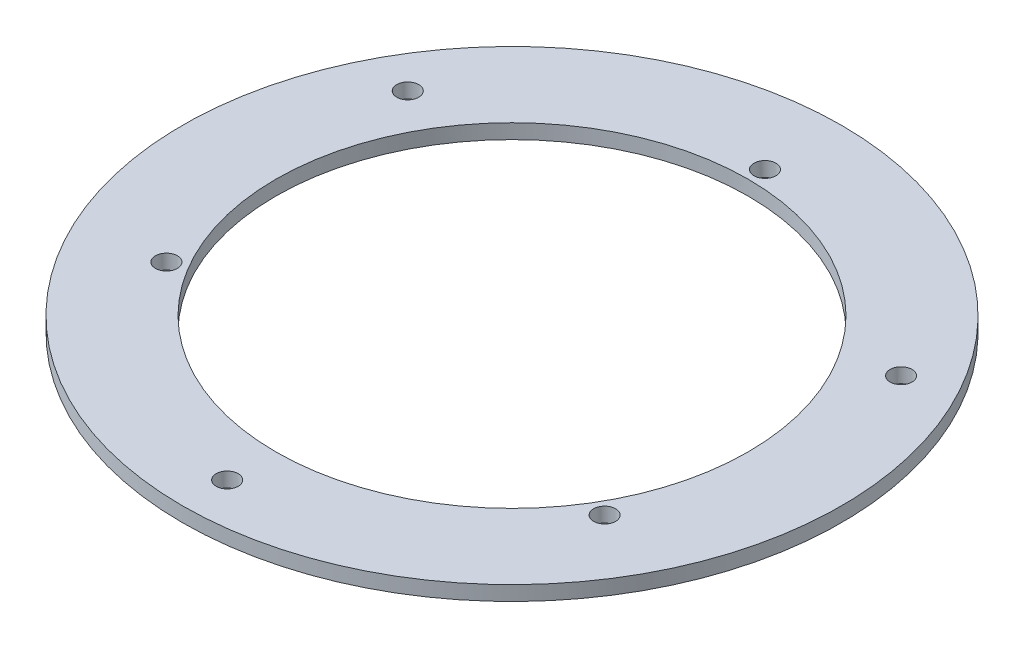
ISO-10303-21;
HEADER;
FILE_DESCRIPTION(('STEP AP214'),'2;1');
FILE_NAME('part.step','',(''),(''),'','','');
FILE_SCHEMA(('AUTOMOTIVE_DESIGN { 1 0 10303 214 1 1 1 1 }'));
ENDSEC;
DATA;
#1=APPLICATION_CONTEXT('core data for automotive mechanical design processes');
#2=APPLICATION_PROTOCOL_DEFINITION('international standard','automotive_design',2000,#1);
#3=PRODUCT_CONTEXT('',#1,'mechanical');
#4=PRODUCT('Part','Part','',(#3));
#5=PRODUCT_RELATED_PRODUCT_CATEGORY('part','',(#4));
#6=PRODUCT_DEFINITION_FORMATION('','',#4);
#7=PRODUCT_DEFINITION_CONTEXT('part definition',#1,'design');
#8=PRODUCT_DEFINITION('design','',#6,#7);
#9=PRODUCT_DEFINITION_SHAPE('','',#8);
#10=(LENGTH_UNIT() NAMED_UNIT(*) SI_UNIT(.MILLI.,.METRE.));
#11=(NAMED_UNIT(*) PLANE_ANGLE_UNIT() SI_UNIT($,.RADIAN.));
#12=(NAMED_UNIT(*) SI_UNIT($,.STERADIAN.) SOLID_ANGLE_UNIT());
#13=UNCERTAINTY_MEASURE_WITH_UNIT(LENGTH_MEASURE(1.E-05),#10,'distance_accuracy_value','');
#14=(GEOMETRIC_REPRESENTATION_CONTEXT(3) GLOBAL_UNCERTAINTY_ASSIGNED_CONTEXT((#13)) GLOBAL_UNIT_ASSIGNED_CONTEXT((#10,
#11,#12)) REPRESENTATION_CONTEXT('',''));
#15=CARTESIAN_POINT('',(0.,0.,0.));
#16=DIRECTION('',(0.,0.,1.));
#17=DIRECTION('',(1.,0.,0.));
#18=AXIS2_PLACEMENT_3D('',#15,#16,#17);
#19=CARTESIAN_POINT('',(0.,2.,0.));
#20=DIRECTION('',(0.,1.,0.));
#21=DIRECTION('',(0.,0.,1.));
#22=AXIS2_PLACEMENT_3D('',#19,#20,#21);
#23=PLANE('',#22);
#24=CARTESIAN_POINT('',(0.,2.,38.8907));
#25=DIRECTION('',(0.,1.,0.));
#26=DIRECTION('',(0.,0.,1.));
#27=AXIS2_PLACEMENT_3D('',#24,#25,#26);
#28=CIRCLE('',#27,1.5);
#29=CARTESIAN_POINT('',(0.,2.,40.3907));
#30=VERTEX_POINT('',#29);
#31=EDGE_CURVE('E88',#30,#30,#28,.T.);
#32=ORIENTED_EDGE('',*,*,#31,.F.);
#33=EDGE_LOOP('',(#32));
#34=FACE_BOUND('',#33,.T.);
#35=CARTESIAN_POINT('',(-33.6803341709596,2.,-19.4453499999999));
#36=DIRECTION('',(0.,1.,0.));
#37=DIRECTION('',(0.,0.,1.));
#38=AXIS2_PLACEMENT_3D('',#35,#36,#37);
#39=CIRCLE('',#38,1.5);
#40=CARTESIAN_POINT('',(-33.6803341709596,2.,-17.9453499999999));
#41=VERTEX_POINT('',#40);
#42=EDGE_CURVE('E72',#41,#41,#39,.T.);
#43=ORIENTED_EDGE('',*,*,#42,.F.);
#44=EDGE_LOOP('',(#43));
#45=FACE_BOUND('',#44,.T.);
#46=CARTESIAN_POINT('',(-29.9158741611796,2.,17.271938));
#47=DIRECTION('',(0.,1.,0.));
#48=DIRECTION('',(0.,0.,1.));
#49=AXIS2_PLACEMENT_3D('',#46,#47,#48);
#50=CIRCLE('',#49,1.5);
#51=CARTESIAN_POINT('',(-29.9158741611796,2.,18.771938));
#52=VERTEX_POINT('',#51);
#53=EDGE_CURVE('E56',#52,#52,#50,.T.);
#54=ORIENTED_EDGE('',*,*,#53,.F.);
#55=EDGE_LOOP('',(#54));
#56=FACE_BOUND('',#55,.T.);
#57=CARTESIAN_POINT('',(0.,2.,0.));
#58=DIRECTION('',(0.,1.,0.));
#59=DIRECTION('',(0.,0.,1.));
#60=AXIS2_PLACEMENT_3D('',#57,#58,#59);
#61=CIRCLE('',#60,45.);
#62=CARTESIAN_POINT('',(0.,2.,45.));
#63=VERTEX_POINT('',#62);
#64=EDGE_CURVE('E10',#63,#63,#61,.T.);
#65=ORIENTED_EDGE('',*,*,#64,.T.);
#66=EDGE_LOOP('',(#65));
#67=FACE_BOUND('',#66,.T.);
#68=CARTESIAN_POINT('',(0.,2.,-34.543876));
#69=DIRECTION('',(0.,1.,0.));
#70=DIRECTION('',(0.,0.,1.));
#71=AXIS2_PLACEMENT_3D('',#68,#69,#70);
#72=CIRCLE('',#71,1.5);
#73=CARTESIAN_POINT('',(0.,2.,-33.043876));
#74=VERTEX_POINT('',#73);
#75=EDGE_CURVE('E50',#74,#74,#72,.T.);
#76=ORIENTED_EDGE('',*,*,#75,.F.);
#77=EDGE_LOOP('',(#76));
#78=FACE_BOUND('',#77,.T.);
#79=CARTESIAN_POINT('',(29.9158741611796,2.,17.271938));
#80=DIRECTION('',(0.,1.,0.));
#81=DIRECTION('',(0.,0.,1.));
#82=AXIS2_PLACEMENT_3D('',#79,#80,#81);
#83=CIRCLE('',#82,1.5);
#84=CARTESIAN_POINT('',(29.9158741611796,2.,18.771938));
#85=VERTEX_POINT('',#84);
#86=EDGE_CURVE('E64',#85,#85,#83,.T.);
#87=ORIENTED_EDGE('',*,*,#86,.F.);
#88=EDGE_LOOP('',(#87));
#89=FACE_BOUND('',#88,.T.);
#90=CARTESIAN_POINT('',(33.6803341709594,2.,-19.4453500000001));
#91=DIRECTION('',(0.,1.,0.));
#92=DIRECTION('',(0.,0.,1.));
#93=AXIS2_PLACEMENT_3D('',#90,#91,#92);
#94=CIRCLE('',#93,1.5);
#95=CARTESIAN_POINT('',(33.6803341709594,2.,-17.9453500000001));
#96=VERTEX_POINT('',#95);
#97=EDGE_CURVE('E80',#96,#96,#94,.T.);
#98=ORIENTED_EDGE('',*,*,#97,.F.);
#99=EDGE_LOOP('',(#98));
#100=FACE_BOUND('',#99,.T.);
#101=CARTESIAN_POINT('',(0.,2.,0.));
#102=DIRECTION('',(0.,1.,0.));
#103=DIRECTION('',(0.,0.,1.));
#104=AXIS2_PLACEMENT_3D('',#101,#102,#103);
#105=CIRCLE('',#104,32.25);
#106=CARTESIAN_POINT('',(0.,2.,32.25));
#107=VERTEX_POINT('',#106);
#108=EDGE_CURVE('E96',#107,#107,#105,.T.);
#109=ORIENTED_EDGE('',*,*,#108,.F.);
#110=EDGE_LOOP('',(#109));
#111=FACE_BOUND('',#110,.T.);
#112=ADVANCED_FACE('F37',(#34,#45,#56,#67,#78,#89,#100,#111),#23,.T.);
#113=CARTESIAN_POINT('',(0.,0.,0.));
#114=DIRECTION('',(0.,1.,0.));
#115=DIRECTION('',(0.,0.,1.));
#116=AXIS2_PLACEMENT_3D('',#113,#114,#115);
#117=PLANE('',#116);
#118=CARTESIAN_POINT('',(0.,0.,0.));
#119=DIRECTION('',(0.,1.,0.));
#120=DIRECTION('',(0.,0.,1.));
#121=AXIS2_PLACEMENT_3D('',#118,#119,#120);
#122=CIRCLE('',#121,45.);
#123=CARTESIAN_POINT('',(0.,0.,45.));
#124=VERTEX_POINT('',#123);
#125=EDGE_CURVE('E41',#124,#124,#122,.T.);
#126=ORIENTED_EDGE('',*,*,#125,.F.);
#127=EDGE_LOOP('',(#126));
#128=FACE_BOUND('',#127,.T.);
#129=CARTESIAN_POINT('',(0.,0.,-34.543876));
#130=DIRECTION('',(0.,1.,0.));
#131=DIRECTION('',(0.,0.,1.));
#132=AXIS2_PLACEMENT_3D('',#129,#130,#131);
#133=CIRCLE('',#132,1.5);
#134=CARTESIAN_POINT('',(0.,0.,-33.043876));
#135=VERTEX_POINT('',#134);
#136=EDGE_CURVE('E52',#135,#135,#133,.T.);
#137=ORIENTED_EDGE('',*,*,#136,.T.);
#138=EDGE_LOOP('',(#137));
#139=FACE_BOUND('',#138,.T.);
#140=CARTESIAN_POINT('',(-29.9158741611796,0.,17.271938));
#141=DIRECTION('',(0.,1.,0.));
#142=DIRECTION('',(0.,0.,1.));
#143=AXIS2_PLACEMENT_3D('',#140,#141,#142);
#144=CIRCLE('',#143,1.5);
#145=CARTESIAN_POINT('',(-29.9158741611796,0.,18.771938));
#146=VERTEX_POINT('',#145);
#147=EDGE_CURVE('E60',#146,#146,#144,.T.);
#148=ORIENTED_EDGE('',*,*,#147,.T.);
#149=EDGE_LOOP('',(#148));
#150=FACE_BOUND('',#149,.T.);
#151=CARTESIAN_POINT('',(29.9158741611796,0.,17.271938));
#152=DIRECTION('',(0.,1.,0.));
#153=DIRECTION('',(0.,0.,1.));
#154=AXIS2_PLACEMENT_3D('',#151,#152,#153);
#155=CIRCLE('',#154,1.5);
#156=CARTESIAN_POINT('',(29.9158741611796,0.,18.771938));
#157=VERTEX_POINT('',#156);
#158=EDGE_CURVE('E68',#157,#157,#155,.T.);
#159=ORIENTED_EDGE('',*,*,#158,.T.);
#160=EDGE_LOOP('',(#159));
#161=FACE_BOUND('',#160,.T.);
#162=CARTESIAN_POINT('',(-33.6803341709596,0.,-19.4453499999999));
#163=DIRECTION('',(0.,1.,0.));
#164=DIRECTION('',(0.,0.,1.));
#165=AXIS2_PLACEMENT_3D('',#162,#163,#164);
#166=CIRCLE('',#165,1.5);
#167=CARTESIAN_POINT('',(-33.6803341709596,0.,-17.9453499999999));
#168=VERTEX_POINT('',#167);
#169=EDGE_CURVE('E76',#168,#168,#166,.T.);
#170=ORIENTED_EDGE('',*,*,#169,.T.);
#171=EDGE_LOOP('',(#170));
#172=FACE_BOUND('',#171,.T.);
#173=CARTESIAN_POINT('',(33.6803341709594,0.,-19.4453500000001));
#174=DIRECTION('',(0.,1.,0.));
#175=DIRECTION('',(0.,0.,1.));
#176=AXIS2_PLACEMENT_3D('',#173,#174,#175);
#177=CIRCLE('',#176,1.5);
#178=CARTESIAN_POINT('',(33.6803341709594,0.,-17.9453500000001));
#179=VERTEX_POINT('',#178);
#180=EDGE_CURVE('E84',#179,#179,#177,.T.);
#181=ORIENTED_EDGE('',*,*,#180,.T.);
#182=EDGE_LOOP('',(#181));
#183=FACE_BOUND('',#182,.T.);
#184=CARTESIAN_POINT('',(0.,0.,38.8907));
#185=DIRECTION('',(0.,1.,0.));
#186=DIRECTION('',(0.,0.,1.));
#187=AXIS2_PLACEMENT_3D('',#184,#185,#186);
#188=CIRCLE('',#187,1.5);
#189=CARTESIAN_POINT('',(0.,0.,40.3907));
#190=VERTEX_POINT('',#189);
#191=EDGE_CURVE('E92',#190,#190,#188,.T.);
#192=ORIENTED_EDGE('',*,*,#191,.T.);
#193=EDGE_LOOP('',(#192));
#194=FACE_BOUND('',#193,.T.);
#195=CARTESIAN_POINT('',(0.,0.,0.));
#196=DIRECTION('',(0.,1.,0.));
#197=DIRECTION('',(0.,0.,1.));
#198=AXIS2_PLACEMENT_3D('',#195,#196,#197);
#199=CIRCLE('',#198,32.25);
#200=CARTESIAN_POINT('',(0.,0.,32.25));
#201=VERTEX_POINT('',#200);
#202=EDGE_CURVE('E100',#201,#201,#199,.T.);
#203=ORIENTED_EDGE('',*,*,#202,.T.);
#204=EDGE_LOOP('',(#203));
#205=FACE_BOUND('',#204,.T.);
#206=ADVANCED_FACE('F112',(#128,#139,#150,#161,#172,#183,#194,#205),#117,.F.);
#207=CARTESIAN_POINT('',(0.,2.,0.));
#208=DIRECTION('',(0.,-1.,0.));
#209=DIRECTION('',(0.,0.,-1.));
#210=AXIS2_PLACEMENT_3D('',#207,#208,#209);
#211=CYLINDRICAL_SURFACE('',#210,45.);
#212=ORIENTED_EDGE('',*,*,#64,.F.);
#213=EDGE_LOOP('',(#212));
#214=FACE_BOUND('',#213,.T.);
#215=ORIENTED_EDGE('',*,*,#125,.T.);
#216=EDGE_LOOP('',(#215));
#217=FACE_BOUND('',#216,.T.);
#218=ADVANCED_FACE('F39',(#214,#217),#211,.T.);
#219=CARTESIAN_POINT('',(0.,2.,-34.543876));
#220=DIRECTION('',(0.,-1.,0.));
#221=DIRECTION('',(0.,0.,-1.));
#222=AXIS2_PLACEMENT_3D('',#219,#220,#221);
#223=CYLINDRICAL_SURFACE('',#222,1.5);
#224=ORIENTED_EDGE('',*,*,#75,.T.);
#225=EDGE_LOOP('',(#224));
#226=FACE_BOUND('',#225,.T.);
#227=ORIENTED_EDGE('',*,*,#136,.F.);
#228=EDGE_LOOP('',(#227));
#229=FACE_BOUND('',#228,.T.);
#230=ADVANCED_FACE('F122',(#226,#229),#223,.F.);
#231=CARTESIAN_POINT('',(-29.9158741611796,2.,17.271938));
#232=DIRECTION('',(0.,-1.,0.));
#233=DIRECTION('',(0.,0.,-1.));
#234=AXIS2_PLACEMENT_3D('',#231,#232,#233);
#235=CYLINDRICAL_SURFACE('',#234,1.5);
#236=ORIENTED_EDGE('',*,*,#53,.T.);
#237=EDGE_LOOP('',(#236));
#238=FACE_BOUND('',#237,.T.);
#239=ORIENTED_EDGE('',*,*,#147,.F.);
#240=EDGE_LOOP('',(#239));
#241=FACE_BOUND('',#240,.T.);
#242=ADVANCED_FACE('F125',(#238,#241),#235,.F.);
#243=CARTESIAN_POINT('',(29.9158741611796,2.,17.271938));
#244=DIRECTION('',(0.,-1.,0.));
#245=DIRECTION('',(0.,0.,-1.));
#246=AXIS2_PLACEMENT_3D('',#243,#244,#245);
#247=CYLINDRICAL_SURFACE('',#246,1.5);
#248=ORIENTED_EDGE('',*,*,#86,.T.);
#249=EDGE_LOOP('',(#248));
#250=FACE_BOUND('',#249,.T.);
#251=ORIENTED_EDGE('',*,*,#158,.F.);
#252=EDGE_LOOP('',(#251));
#253=FACE_BOUND('',#252,.T.);
#254=ADVANCED_FACE('F129',(#250,#253),#247,.F.);
#255=CARTESIAN_POINT('',(-33.6803341709596,2.,-19.4453499999999));
#256=DIRECTION('',(0.,-1.,0.));
#257=DIRECTION('',(0.,0.,-1.));
#258=AXIS2_PLACEMENT_3D('',#255,#256,#257);
#259=CYLINDRICAL_SURFACE('',#258,1.5);
#260=ORIENTED_EDGE('',*,*,#42,.T.);
#261=EDGE_LOOP('',(#260));
#262=FACE_BOUND('',#261,.T.);
#263=ORIENTED_EDGE('',*,*,#169,.F.);
#264=EDGE_LOOP('',(#263));
#265=FACE_BOUND('',#264,.T.);
#266=ADVANCED_FACE('F133',(#262,#265),#259,.F.);
#267=CARTESIAN_POINT('',(33.6803341709594,2.,-19.4453500000001));
#268=DIRECTION('',(0.,-1.,0.));
#269=DIRECTION('',(0.,0.,-1.));
#270=AXIS2_PLACEMENT_3D('',#267,#268,#269);
#271=CYLINDRICAL_SURFACE('',#270,1.5);
#272=ORIENTED_EDGE('',*,*,#97,.T.);
#273=EDGE_LOOP('',(#272));
#274=FACE_BOUND('',#273,.T.);
#275=ORIENTED_EDGE('',*,*,#180,.F.);
#276=EDGE_LOOP('',(#275));
#277=FACE_BOUND('',#276,.T.);
#278=ADVANCED_FACE('F137',(#274,#277),#271,.F.);
#279=CARTESIAN_POINT('',(0.,2.,38.8907));
#280=DIRECTION('',(0.,-1.,0.));
#281=DIRECTION('',(0.,0.,-1.));
#282=AXIS2_PLACEMENT_3D('',#279,#280,#281);
#283=CYLINDRICAL_SURFACE('',#282,1.5);
#284=ORIENTED_EDGE('',*,*,#31,.T.);
#285=EDGE_LOOP('',(#284));
#286=FACE_BOUND('',#285,.T.);
#287=ORIENTED_EDGE('',*,*,#191,.F.);
#288=EDGE_LOOP('',(#287));
#289=FACE_BOUND('',#288,.T.);
#290=ADVANCED_FACE('F141',(#286,#289),#283,.F.);
#291=CARTESIAN_POINT('',(0.,2.,0.));
#292=DIRECTION('',(0.,-1.,0.));
#293=DIRECTION('',(0.,0.,-1.));
#294=AXIS2_PLACEMENT_3D('',#291,#292,#293);
#295=CYLINDRICAL_SURFACE('',#294,32.25);
#296=ORIENTED_EDGE('',*,*,#108,.T.);
#297=EDGE_LOOP('',(#296));
#298=FACE_BOUND('',#297,.T.);
#299=ORIENTED_EDGE('',*,*,#202,.F.);
#300=EDGE_LOOP('',(#299));
#301=FACE_BOUND('',#300,.T.);
#302=ADVANCED_FACE('F108',(#298,#301),#295,.F.);
#303=CLOSED_SHELL('',(#112,#206,#218,#230,#242,#254,#266,#278,#290,#302));
#304=MANIFOLD_SOLID_BREP('B2',#303);
#305=ADVANCED_BREP_SHAPE_REPRESENTATION('',(#18,#304),#14);
#306=SHAPE_DEFINITION_REPRESENTATION(#9,#305);
ENDSEC;
END-ISO-10303-21;
